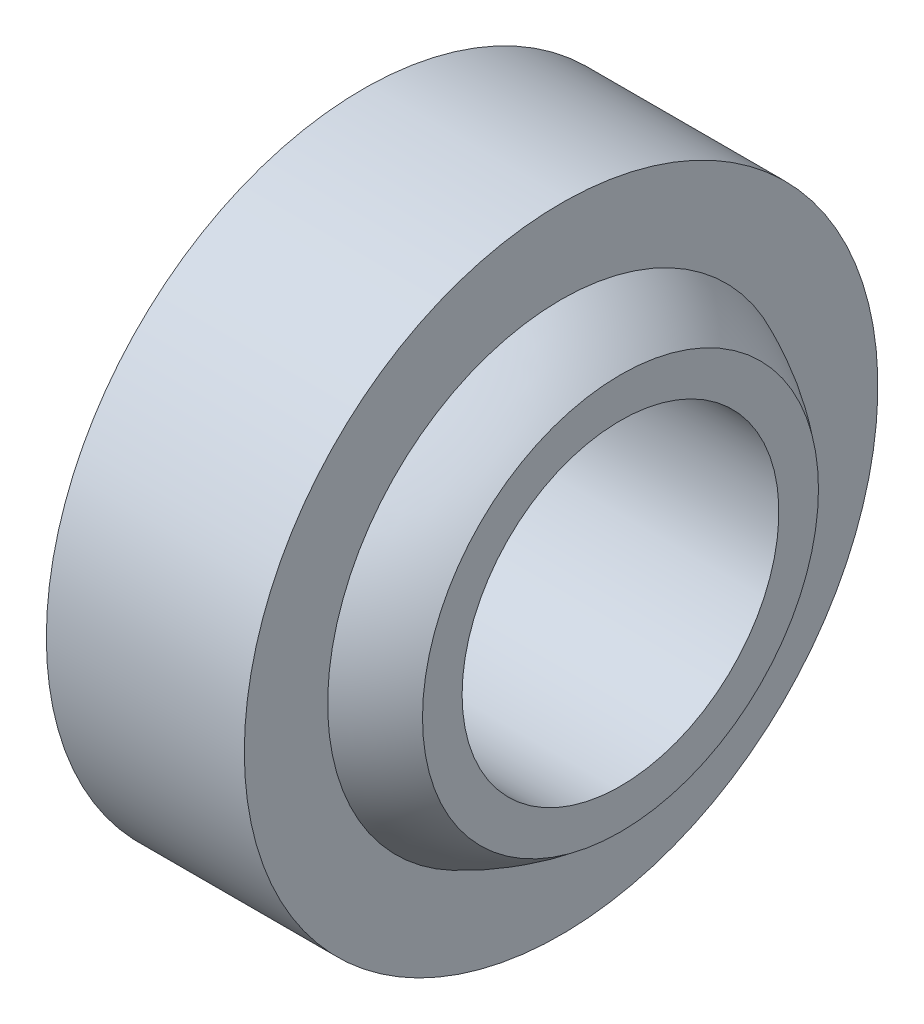
ISO-10303-21;
HEADER;
FILE_DESCRIPTION(('STEP AP214'),'2;1');
FILE_NAME('part.step','',(''),(''),'','','');
FILE_SCHEMA(('AUTOMOTIVE_DESIGN { 1 0 10303 214 1 1 1 1 }'));
ENDSEC;
DATA;
#1=APPLICATION_CONTEXT('core data for automotive mechanical design processes');
#2=APPLICATION_PROTOCOL_DEFINITION('international standard','automotive_design',2000,#1);
#3=PRODUCT_CONTEXT('',#1,'mechanical');
#4=PRODUCT('Part','Part','',(#3));
#5=PRODUCT_RELATED_PRODUCT_CATEGORY('part','',(#4));
#6=PRODUCT_DEFINITION_FORMATION('','',#4);
#7=PRODUCT_DEFINITION_CONTEXT('part definition',#1,'design');
#8=PRODUCT_DEFINITION('design','',#6,#7);
#9=PRODUCT_DEFINITION_SHAPE('','',#8);
#10=(LENGTH_UNIT() NAMED_UNIT(*) SI_UNIT(.MILLI.,.METRE.));
#11=(NAMED_UNIT(*) PLANE_ANGLE_UNIT() SI_UNIT($,.RADIAN.));
#12=(NAMED_UNIT(*) SI_UNIT($,.STERADIAN.) SOLID_ANGLE_UNIT());
#13=UNCERTAINTY_MEASURE_WITH_UNIT(LENGTH_MEASURE(1.E-05),#10,'distance_accuracy_value','');
#14=(GEOMETRIC_REPRESENTATION_CONTEXT(3) GLOBAL_UNCERTAINTY_ASSIGNED_CONTEXT((#13)) GLOBAL_UNIT_ASSIGNED_CONTEXT((#10,
#11,#12)) REPRESENTATION_CONTEXT('',''));
#15=CARTESIAN_POINT('',(0.,0.,0.));
#16=DIRECTION('',(0.,0.,1.));
#17=DIRECTION('',(1.,0.,0.));
#18=AXIS2_PLACEMENT_3D('',#15,#16,#17);
#19=CARTESIAN_POINT('',(-0.556834499522955,8.,0.));
#20=DIRECTION('',(1.,0.,0.));
#21=DIRECTION('',(0.,0.,-1.));
#22=AXIS2_PLACEMENT_3D('',#19,#20,#21);
#23=PLANE('',#22);
#24=CARTESIAN_POINT('',(-0.556834499522955,0.,0.));
#25=DIRECTION('',(-1.,0.,0.));
#26=DIRECTION('',(0.,0.,1.));
#27=AXIS2_PLACEMENT_3D('',#24,#25,#26);
#28=CIRCLE('',#27,5.8949130612758);
#29=CARTESIAN_POINT('',(-0.556834499522955,5.8949130612758,0.));
#30=VERTEX_POINT('',#29);
#31=EDGE_CURVE('E10',#30,#30,#28,.T.);
#32=ORIENTED_EDGE('',*,*,#31,.F.);
#33=EDGE_LOOP('',(#32));
#34=FACE_BOUND('',#33,.T.);
#35=CARTESIAN_POINT('',(-0.556834499522955,0.,0.));
#36=DIRECTION('',(-1.,0.,0.));
#37=DIRECTION('',(0.,0.,1.));
#38=AXIS2_PLACEMENT_3D('',#35,#36,#37);
#39=CIRCLE('',#38,8.);
#40=CARTESIAN_POINT('',(-0.556834499522955,0.,8.));
#41=VERTEX_POINT('',#40);
#42=EDGE_CURVE('E67',#41,#41,#39,.T.);
#43=ORIENTED_EDGE('',*,*,#42,.T.);
#44=EDGE_LOOP('',(#43));
#45=FACE_BOUND('',#44,.T.);
#46=ADVANCED_FACE('F39',(#34,#45),#23,.F.);
#47=CARTESIAN_POINT('',(1.94316550047704,0.,0.));
#48=DIRECTION('',(-1.,0.,0.));
#49=DIRECTION('',(0.,1.,0.));
#50=AXIS2_PLACEMENT_3D('',#47,#48,#49);
#51=SPHERICAL_SURFACE('',#50,6.40312423743285);
#52=CARTESIAN_POINT('',(-2.05683449952296,0.,0.));
#53=DIRECTION('',(-1.,0.,0.));
#54=DIRECTION('',(0.,0.,1.));
#55=AXIS2_PLACEMENT_3D('',#52,#53,#54);
#56=CIRCLE('',#55,5.);
#57=CARTESIAN_POINT('',(-2.05683449952296,5.,0.));
#58=VERTEX_POINT('',#57);
#59=EDGE_CURVE('E45',#58,#58,#56,.T.);
#60=CARTESIAN_POINT('',(-2.05683449952296,5.,0.));
#61=CARTESIAN_POINT('',(-2.04258254552078,5.01140156582587,0.));
#62=CARTESIAN_POINT('',(-2.02828184065316,5.02274219302135,0.));
#63=CARTESIAN_POINT('',(-1.9995839804471,5.04530074797691,0.));
#64=CARTESIAN_POINT('',(-1.98518682510867,5.05651867573697,0.));
#65=CARTESIAN_POINT('',(-1.95629711522105,5.07883100964705,0.));
#66=CARTESIAN_POINT('',(-1.94180456067188,5.08992541579706,0.));
#67=CARTESIAN_POINT('',(-1.9127251124884,5.1119898957486,0.));
#68=CARTESIAN_POINT('',(-1.8981382188541,5.12295996955013,0.));
#69=CARTESIAN_POINT('',(-1.86887115901791,5.14477498251355,0.));
#70=CARTESIAN_POINT('',(-1.85419099281602,5.15561992167545,0.));
#71=CARTESIAN_POINT('',(-1.82473846131816,5.17718387239118,0.));
#72=CARTESIAN_POINT('',(-1.80996609602218,5.18790288394501,0.));
#73=CARTESIAN_POINT('',(-1.78033024651509,5.20921419563803,0.));
#74=CARTESIAN_POINT('',(-1.76546676230396,5.21980649577721,0.));
#75=CARTESIAN_POINT('',(-1.73564976181806,5.24086361011213,0.));
#76=CARTESIAN_POINT('',(-1.72069624554327,5.25132842430787,0.));
#77=CARTESIAN_POINT('',(-1.69070027436226,5.27212980154584,0.));
#78=CARTESIAN_POINT('',(-1.67565781945603,5.28246636458807,0.));
#79=CARTESIAN_POINT('',(-1.64548507094842,5.30301048368783,0.));
#80=CARTESIAN_POINT('',(-1.63035477734703,5.31321803974537,0.));
#81=CARTESIAN_POINT('',(-1.60000745780817,5.33350339847759,0.));
#82=CARTESIAN_POINT('',(-1.58479043187069,5.34358120115228,0.));
#83=CARTESIAN_POINT('',(-1.55427076036079,5.36360631620855,0.));
#84=CARTESIAN_POINT('',(-1.53896811478837,5.37355362859013,0.));
#85=CARTESIAN_POINT('',(-1.50827832297043,5.39331703569165,0.));
#86=CARTESIAN_POINT('',(-1.49289117672491,5.40313313041159,0.));
#87=CARTESIAN_POINT('',(-1.46203350870147,5.4226333844162,0.));
#88=CARTESIAN_POINT('',(-1.44656298692356,5.43231754370088,0.));
#89=CARTESIAN_POINT('',(-1.41553969907263,5.45155321870873,0.));
#90=CARTESIAN_POINT('',(-1.39998693299962,5.4611047344319,0.));
#91=CARTESIAN_POINT('',(-1.36880029380969,5.48007442388971,0.));
#92=CARTESIAN_POINT('',(-1.35316642069276,5.48949259762435,0.));
#93=CARTESIAN_POINT('',(-1.32181871059689,5.50819491442827,0.));
#94=CARTESIAN_POINT('',(-1.30610487361795,5.51747905749755,0.));
#95=CARTESIAN_POINT('',(-1.27459838482706,5.53591263409459,0.));
#96=CARTESIAN_POINT('',(-1.25880573301513,5.54506206762234,0.));
#97=CARTESIAN_POINT('',(-1.22714276935038,5.56322555611035,0.));
#98=CARTESIAN_POINT('',(-1.21127245749758,5.57223961107062,0.));
#99=CARTESIAN_POINT('',(-1.17945533422191,5.59013168329687,0.));
#100=CARTESIAN_POINT('',(-1.16350852279904,5.59900970056287,0.));
#101=CARTESIAN_POINT('',(-1.13153956644784,5.61662904822118,0.));
#102=CARTESIAN_POINT('',(-1.11551742151952,5.62537037861349,0.));
#103=CARTESIAN_POINT('',(-1.08339896973056,5.64271571333985,0.));
#104=CARTESIAN_POINT('',(-1.06730266286993,5.6513197176739,0.));
#105=CARTESIAN_POINT('',(-1.0350370642124,5.66838977114072,0.));
#106=CARTESIAN_POINT('',(-1.01886777241549,5.67685582027348,0.));
#107=CARTESIAN_POINT('',(-0.986457386218275,5.69364934428234,0.));
#108=CARTESIAN_POINT('',(-0.970216291817961,5.70197681915844,0.));
#109=CARTESIAN_POINT('',(-0.937663487997034,5.71849258573116,0.));
#110=CARTESIAN_POINT('',(-0.92135177857642,5.72668087742778,0.));
#111=CARTESIAN_POINT('',(-0.88865893746197,5.74291767889716,0.));
#112=CARTESIAN_POINT('',(-0.872277805768134,5.7509661886699,0.));
#113=CARTESIAN_POINT('',(-0.839447317928939,5.76692283776439,0.));
#114=CARTESIAN_POINT('',(-0.82299796178358,5.77483097708614,0.));
#115=CARTESIAN_POINT('',(-0.790032227858033,5.79050630703013,0.));
#116=CARTESIAN_POINT('',(-0.773515850077845,5.79827349765238,0.));
#117=CARTESIAN_POINT('',(-0.740417280576666,5.81366636220142,0.));
#118=CARTESIAN_POINT('',(-0.723835088855676,5.82129203612821,0.));
#119=CARTESIAN_POINT('',(-0.690606104066819,5.83640130983972,0.));
#120=CARTESIAN_POINT('',(-0.673959310998952,5.84388490962444,0.));
#121=CARTESIAN_POINT('',(-0.640602340507711,5.85870948724243,0.));
#122=CARTESIAN_POINT('',(-0.623892163084336,5.86605046507569,0.));
#123=CARTESIAN_POINT('',(-0.590409646726178,5.88058926421505,0.));
#124=CARTESIAN_POINT('',(-0.573637307791394,5.88778708552114,0.));
#125=CARTESIAN_POINT('',(-0.556834499522955,5.8949130612758,0.));
#126=B_SPLINE_CURVE_WITH_KNOTS('',3,(#60,#61,#62,#63,#64,#65,#66,#67,#68,#69,#70,#71,#72,#73,
#74,#75,#76,#77,#78,#79,#80,#81,#82,#83,#84,#85,#86,#87,#88,#89,#90,#91,#92,#93,#94,#95,#96,#97,
#98,#99,#100,#101,#102,#103,#104,#105,#106,#107,#108,#109,#110,#111,#112,#113,#114,#115,#116,
#117,#118,#119,#120,#121,#122,#123,#124,#125),.UNSPECIFIED.,.F.,.F.,(4,2,2,2,2,2,2,2,2,2,2,2,2,
2,2,2,2,2,2,2,2,2,2,2,2,2,2,2,2,2,2,2,4),(0.,0.0547540573046106,0.109508114609221,
0.164262171913831,0.219016229218441,0.273770286523051,0.328524343827663,0.383278401132273,
0.438032458436882,0.492786515741493,0.547540573046103,0.602294630350713,0.657048687655324,
0.711802744959935,0.766556802264545,0.821310859569155,0.876064916873765,0.930818974178376,
0.985573031482986,1.0403270887876,1.09508114609221,1.14983520339682,1.20458926070143,
1.25934331800604,1.31409737531065,1.36885143261526,1.42360548991987,1.47835954722448,
1.53311360452909,1.5878676618337,1.64262171913831,1.69737577644292,1.75212983374753),.UNSPECIFIED.);
#127=EDGE_CURVE('BSEAM104',#58,#30,#126,.T.);
#128=ORIENTED_EDGE('',*,*,#59,.F.);
#129=ORIENTED_EDGE('',*,*,#31,.T.);
#130=ORIENTED_EDGE('',*,*,#127,.T.);
#131=ORIENTED_EDGE('',*,*,#127,.F.);
#132=EDGE_LOOP('',(#128,#130,#129,#131));
#133=FACE_BOUND('',#132,.T.);
#134=ADVANCED_FACE('F104',(#133),#51,.T.);
#135=CARTESIAN_POINT('',(-2.05683449952296,5.,0.));
#136=DIRECTION('',(1.,0.,0.));
#137=DIRECTION('',(0.,0.,-1.));
#138=AXIS2_PLACEMENT_3D('',#135,#136,#137);
#139=PLANE('',#138);
#140=CARTESIAN_POINT('',(-2.05683449952296,0.,0.));
#141=DIRECTION('',(-1.,0.,0.));
#142=DIRECTION('',(0.,0.,1.));
#143=AXIS2_PLACEMENT_3D('',#140,#141,#142);
#144=CIRCLE('',#143,4.);
#145=CARTESIAN_POINT('',(-2.05683449952296,0.,4.));
#146=VERTEX_POINT('',#145);
#147=EDGE_CURVE('E49',#146,#146,#144,.T.);
#148=ORIENTED_EDGE('',*,*,#147,.F.);
#149=EDGE_LOOP('',(#148));
#150=FACE_BOUND('',#149,.T.);
#151=ORIENTED_EDGE('',*,*,#59,.T.);
#152=EDGE_LOOP('',(#151));
#153=FACE_BOUND('',#152,.T.);
#154=ADVANCED_FACE('F99',(#150,#153),#139,.F.);
#155=CARTESIAN_POINT('',(0.,0.,0.));
#156=DIRECTION('',(-1.,0.,0.));
#157=DIRECTION('',(0.,0.,1.));
#158=AXIS2_PLACEMENT_3D('',#155,#156,#157);
#159=CYLINDRICAL_SURFACE('',#158,4.);
#160=CARTESIAN_POINT('',(5.94316550047704,0.,0.));
#161=DIRECTION('',(-1.,0.,0.));
#162=DIRECTION('',(0.,0.,1.));
#163=AXIS2_PLACEMENT_3D('',#160,#161,#162);
#164=CIRCLE('',#163,4.);
#165=CARTESIAN_POINT('',(5.94316550047704,0.,4.));
#166=VERTEX_POINT('',#165);
#167=EDGE_CURVE('E53',#166,#166,#164,.T.);
#168=ORIENTED_EDGE('',*,*,#167,.F.);
#169=EDGE_LOOP('',(#168));
#170=FACE_BOUND('',#169,.T.);
#171=ORIENTED_EDGE('',*,*,#147,.T.);
#172=EDGE_LOOP('',(#171));
#173=FACE_BOUND('',#172,.T.);
#174=ADVANCED_FACE('F93',(#170,#173),#159,.F.);
#175=CARTESIAN_POINT('',(5.94316550047705,5.,0.));
#176=DIRECTION('',(-1.,0.,0.));
#177=DIRECTION('',(0.,0.,1.));
#178=AXIS2_PLACEMENT_3D('',#175,#176,#177);
#179=PLANE('',#178);
#180=CARTESIAN_POINT('',(5.94316550047705,0.,0.));
#181=DIRECTION('',(-1.,0.,0.));
#182=DIRECTION('',(0.,0.,1.));
#183=AXIS2_PLACEMENT_3D('',#180,#181,#182);
#184=CIRCLE('',#183,5.);
#185=CARTESIAN_POINT('',(5.94316550047705,5.,0.));
#186=VERTEX_POINT('',#185);
#187=EDGE_CURVE('E58',#186,#186,#184,.T.);
#188=ORIENTED_EDGE('',*,*,#187,.F.);
#189=EDGE_LOOP('',(#188));
#190=FACE_BOUND('',#189,.T.);
#191=ORIENTED_EDGE('',*,*,#167,.T.);
#192=EDGE_LOOP('',(#191));
#193=FACE_BOUND('',#192,.T.);
#194=ADVANCED_FACE('F87',(#190,#193),#179,.F.);
#195=CARTESIAN_POINT('',(1.94316550047704,0.,0.));
#196=DIRECTION('',(-1.,0.,0.));
#197=DIRECTION('',(0.,1.,0.));
#198=AXIS2_PLACEMENT_3D('',#195,#196,#197);
#199=SPHERICAL_SURFACE('',#198,6.40312423743285);
#200=CARTESIAN_POINT('',(4.44316550047704,0.,0.));
#201=DIRECTION('',(-1.,0.,0.));
#202=DIRECTION('',(0.,0.,1.));
#203=AXIS2_PLACEMENT_3D('',#200,#201,#202);
#204=CIRCLE('',#203,5.8949130612758);
#205=CARTESIAN_POINT('',(4.44316550047704,5.8949130612758,0.));
#206=VERTEX_POINT('',#205);
#207=EDGE_CURVE('E61',#206,#206,#204,.T.);
#208=CARTESIAN_POINT('',(4.44316550047704,5.8949130612758,0.));
#209=CARTESIAN_POINT('',(4.45996830874548,5.88778708552114,0.));
#210=CARTESIAN_POINT('',(4.47674064768027,5.88058926421505,0.));
#211=CARTESIAN_POINT('',(4.51022316403843,5.86605046507569,0.));
#212=CARTESIAN_POINT('',(4.5269333414618,5.85870948724243,0.));
#213=CARTESIAN_POINT('',(4.56029031195304,5.84388490962444,0.));
#214=CARTESIAN_POINT('',(4.57693710502091,5.83640130983972,0.));
#215=CARTESIAN_POINT('',(4.61016608980977,5.82129203612821,0.));
#216=CARTESIAN_POINT('',(4.62674828153076,5.81366636220142,0.));
#217=CARTESIAN_POINT('',(4.65984685103193,5.79827349765238,0.));
#218=CARTESIAN_POINT('',(4.67636322881212,5.79050630703013,0.));
#219=CARTESIAN_POINT('',(4.70932896273767,5.77483097708614,0.));
#220=CARTESIAN_POINT('',(4.72577831888303,5.76692283776439,0.));
#221=CARTESIAN_POINT('',(4.75860880672222,5.7509661886699,0.));
#222=CARTESIAN_POINT('',(4.77498993841606,5.74291767889716,0.));
#223=CARTESIAN_POINT('',(4.80768277953051,5.72668087742779,0.));
#224=CARTESIAN_POINT('',(4.82399448895112,5.71849258573116,0.));
#225=CARTESIAN_POINT('',(4.85654729277205,5.70197681915844,0.));
#226=CARTESIAN_POINT('',(4.87278838717236,5.69364934428234,0.));
#227=CARTESIAN_POINT('',(4.90519877336958,5.67685582027348,0.));
#228=CARTESIAN_POINT('',(4.92136806516649,5.66838977114072,0.));
#229=CARTESIAN_POINT('',(4.95363366382402,5.6513197176739,0.));
#230=CARTESIAN_POINT('',(4.96972997068465,5.64271571333985,0.));
#231=CARTESIAN_POINT('',(5.00184842247361,5.62537037861349,0.));
#232=CARTESIAN_POINT('',(5.01787056740193,5.61662904822118,0.));
#233=CARTESIAN_POINT('',(5.04983952375313,5.59900970056287,0.));
#234=CARTESIAN_POINT('',(5.065786335176,5.59013168329687,0.));
#235=CARTESIAN_POINT('',(5.09760345845167,5.57223961107062,0.));
#236=CARTESIAN_POINT('',(5.11347377030447,5.56322555611035,0.));
#237=CARTESIAN_POINT('',(5.14513673396921,5.54506206762234,0.));
#238=CARTESIAN_POINT('',(5.16092938578115,5.53591263409459,0.));
#239=CARTESIAN_POINT('',(5.19243587457204,5.51747905749755,0.));
#240=CARTESIAN_POINT('',(5.20814971155098,5.50819491442827,0.));
#241=CARTESIAN_POINT('',(5.23949742164685,5.48949259762435,0.));
#242=CARTESIAN_POINT('',(5.25513129476378,5.48007442388971,0.));
#243=CARTESIAN_POINT('',(5.28631793395371,5.4611047344319,0.));
#244=CARTESIAN_POINT('',(5.30187070002672,5.45155321870873,0.));
#245=CARTESIAN_POINT('',(5.33289398787765,5.43231754370088,0.));
#246=CARTESIAN_POINT('',(5.34836450965556,5.42263338441621,0.));
#247=CARTESIAN_POINT('',(5.379222177679,5.40313313041159,0.));
#248=CARTESIAN_POINT('',(5.39460932392452,5.39331703569165,0.));
#249=CARTESIAN_POINT('',(5.42529911574246,5.37355362859013,0.));
#250=CARTESIAN_POINT('',(5.44060176131488,5.36360631620855,0.));
#251=CARTESIAN_POINT('',(5.47112143282478,5.34358120115228,0.));
#252=CARTESIAN_POINT('',(5.48633845876225,5.33350339847759,0.));
#253=CARTESIAN_POINT('',(5.51668577830112,5.31321803974537,0.));
#254=CARTESIAN_POINT('',(5.53181607190251,5.30301048368783,0.));
#255=CARTESIAN_POINT('',(5.56198882041012,5.28246636458807,0.));
#256=CARTESIAN_POINT('',(5.57703127531635,5.27212980154584,0.));
#257=CARTESIAN_POINT('',(5.60702724649736,5.25132842430787,0.));
#258=CARTESIAN_POINT('',(5.62198076277215,5.24086361011213,0.));
#259=CARTESIAN_POINT('',(5.65179776325805,5.21980649577721,0.));
#260=CARTESIAN_POINT('',(5.66666124746917,5.20921419563803,0.));
#261=CARTESIAN_POINT('',(5.69629709697627,5.18790288394501,0.));
#262=CARTESIAN_POINT('',(5.71106946227225,5.17718387239118,0.));
#263=CARTESIAN_POINT('',(5.74052199377011,5.15561992167545,0.));
#264=CARTESIAN_POINT('',(5.755202159972,5.14477498251355,0.));
#265=CARTESIAN_POINT('',(5.78446921980819,5.12295996955013,0.));
#266=CARTESIAN_POINT('',(5.79905611344249,5.1119898957486,0.));
#267=CARTESIAN_POINT('',(5.82813556162596,5.08992541579706,0.));
#268=CARTESIAN_POINT('',(5.84262811617514,5.07883100964705,0.));
#269=CARTESIAN_POINT('',(5.87151782606275,5.05651867573697,0.));
#270=CARTESIAN_POINT('',(5.88591498140119,5.04530074797691,0.));
#271=CARTESIAN_POINT('',(5.91461284160725,5.02274219302135,0.));
#272=CARTESIAN_POINT('',(5.92891354647487,5.01140156582587,0.));
#273=CARTESIAN_POINT('',(5.94316550047705,5.,0.));
#274=B_SPLINE_CURVE_WITH_KNOTS('',3,(#208,#209,#210,#211,#212,#213,#214,#215,#216,#217,#218,
#219,#220,#221,#222,#223,#224,#225,#226,#227,#228,#229,#230,#231,#232,#233,#234,#235,#236,#237,
#238,#239,#240,#241,#242,#243,#244,#245,#246,#247,#248,#249,#250,#251,#252,#253,#254,#255,#256,
#257,#258,#259,#260,#261,#262,#263,#264,#265,#266,#267,#268,#269,#270,#271,#272,#273),
.UNSPECIFIED.,.F.,.F.,(4,2,2,2,2,2,2,2,2,2,2,2,2,2,2,2,2,2,2,2,2,2,2,2,2,2,2,2,2,2,2,2,4),(0.,
0.0547540573046104,0.10950811460922,0.164262171913831,0.219016229218441,0.273770286523052,
0.328524343827662,0.383278401132272,0.438032458436882,0.492786515741493,0.547540573046104,
0.602294630350713,0.657048687655325,0.711802744959935,0.766556802264545,0.821310859569155,
0.876064916873766,0.930818974178376,0.985573031482986,1.0403270887876,1.09508114609221,
1.14983520339682,1.20458926070143,1.25934331800604,1.31409737531065,1.36885143261526,
1.42360548991987,1.47835954722448,1.53311360452909,1.5878676618337,1.64262171913831,
1.69737577644292,1.75212983374753),.UNSPECIFIED.);
#275=EDGE_CURVE('BSEAM81',#206,#186,#274,.T.);
#276=ORIENTED_EDGE('',*,*,#207,.F.);
#277=ORIENTED_EDGE('',*,*,#187,.T.);
#278=ORIENTED_EDGE('',*,*,#275,.T.);
#279=ORIENTED_EDGE('',*,*,#275,.F.);
#280=EDGE_LOOP('',(#276,#278,#277,#279));
#281=FACE_BOUND('',#280,.T.);
#282=ADVANCED_FACE('F81',(#281),#199,.T.);
#283=CARTESIAN_POINT('',(4.44316550047704,5.8949130612758,0.));
#284=DIRECTION('',(-1.,0.,0.));
#285=DIRECTION('',(0.,0.,1.));
#286=AXIS2_PLACEMENT_3D('',#283,#284,#285);
#287=PLANE('',#286);
#288=CARTESIAN_POINT('',(4.44316550047704,0.,0.));
#289=DIRECTION('',(-1.,0.,0.));
#290=DIRECTION('',(0.,0.,1.));
#291=AXIS2_PLACEMENT_3D('',#288,#289,#290);
#292=CIRCLE('',#291,8.);
#293=CARTESIAN_POINT('',(4.44316550047704,0.,8.));
#294=VERTEX_POINT('',#293);
#295=EDGE_CURVE('E64',#294,#294,#292,.T.);
#296=ORIENTED_EDGE('',*,*,#295,.F.);
#297=EDGE_LOOP('',(#296));
#298=FACE_BOUND('',#297,.T.);
#299=ORIENTED_EDGE('',*,*,#207,.T.);
#300=EDGE_LOOP('',(#299));
#301=FACE_BOUND('',#300,.T.);
#302=ADVANCED_FACE('F75',(#298,#301),#287,.F.);
#303=CARTESIAN_POINT('',(0.,0.,0.));
#304=DIRECTION('',(-1.,0.,0.));
#305=DIRECTION('',(0.,0.,1.));
#306=AXIS2_PLACEMENT_3D('',#303,#304,#305);
#307=CYLINDRICAL_SURFACE('',#306,8.);
#308=ORIENTED_EDGE('',*,*,#42,.F.);
#309=EDGE_LOOP('',(#308));
#310=FACE_BOUND('',#309,.T.);
#311=ORIENTED_EDGE('',*,*,#295,.T.);
#312=EDGE_LOOP('',(#311));
#313=FACE_BOUND('',#312,.T.);
#314=ADVANCED_FACE('F72',(#310,#313),#307,.T.);
#315=CLOSED_SHELL('',(#46,#134,#154,#174,#194,#282,#302,#314));
#316=MANIFOLD_SOLID_BREP('B2',#315);
#317=ADVANCED_BREP_SHAPE_REPRESENTATION('',(#18,#316),#14);
#318=SHAPE_DEFINITION_REPRESENTATION(#9,#317);
ENDSEC;
END-ISO-10303-21;
